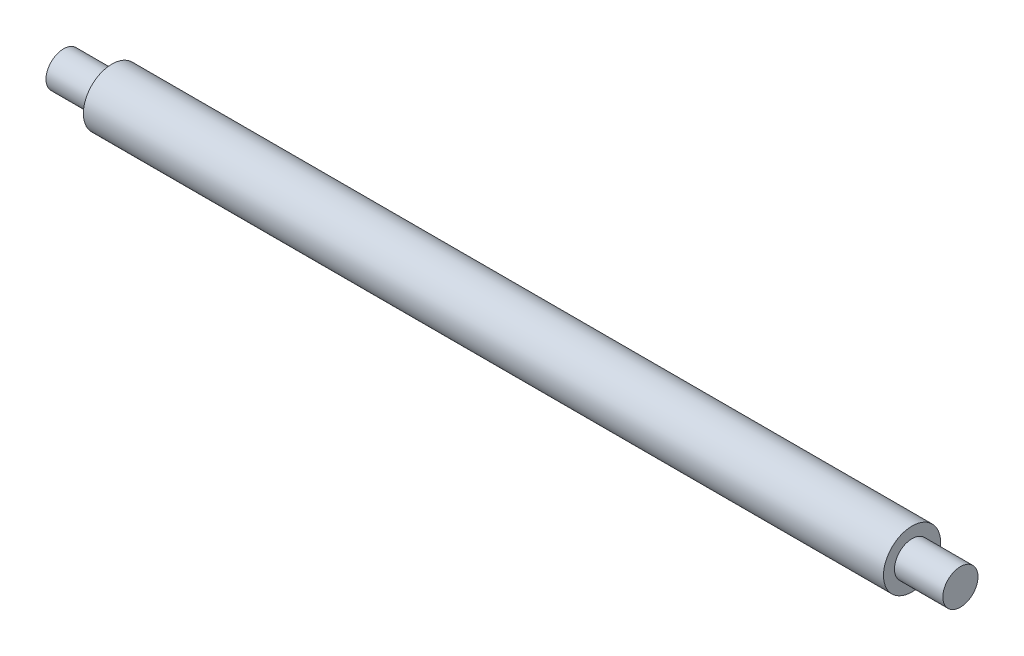
ISO-10303-21;
HEADER;
FILE_DESCRIPTION(('STEP AP214'),'2;1');
FILE_NAME('part.step','',(''),(''),'','','');
FILE_SCHEMA(('AUTOMOTIVE_DESIGN { 1 0 10303 214 1 1 1 1 }'));
ENDSEC;
DATA;
#1=APPLICATION_CONTEXT('core data for automotive mechanical design processes');
#2=APPLICATION_PROTOCOL_DEFINITION('international standard','automotive_design',2000,#1);
#3=PRODUCT_CONTEXT('',#1,'mechanical');
#4=PRODUCT('Part','Part','',(#3));
#5=PRODUCT_RELATED_PRODUCT_CATEGORY('part','',(#4));
#6=PRODUCT_DEFINITION_FORMATION('','',#4);
#7=PRODUCT_DEFINITION_CONTEXT('part definition',#1,'design');
#8=PRODUCT_DEFINITION('design','',#6,#7);
#9=PRODUCT_DEFINITION_SHAPE('','',#8);
#10=(LENGTH_UNIT() NAMED_UNIT(*) SI_UNIT(.MILLI.,.METRE.));
#11=(NAMED_UNIT(*) PLANE_ANGLE_UNIT() SI_UNIT($,.RADIAN.));
#12=(NAMED_UNIT(*) SI_UNIT($,.STERADIAN.) SOLID_ANGLE_UNIT());
#13=UNCERTAINTY_MEASURE_WITH_UNIT(LENGTH_MEASURE(1.E-05),#10,'distance_accuracy_value','');
#14=(GEOMETRIC_REPRESENTATION_CONTEXT(3) GLOBAL_UNCERTAINTY_ASSIGNED_CONTEXT((#13)) GLOBAL_UNIT_ASSIGNED_CONTEXT((#10,
#11,#12)) REPRESENTATION_CONTEXT('',''));
#15=CARTESIAN_POINT('',(0.,0.,0.));
#16=DIRECTION('',(0.,0.,1.));
#17=DIRECTION('',(1.,0.,0.));
#18=AXIS2_PLACEMENT_3D('',#15,#16,#17);
#19=CARTESIAN_POINT('',(0.,4.,0.));
#20=DIRECTION('',(1.,0.,0.));
#21=DIRECTION('',(0.,1.,0.));
#22=AXIS2_PLACEMENT_3D('',#19,#20,#21);
#23=PLANE('',#22);
#24=CARTESIAN_POINT('',(0.,0.,0.));
#25=DIRECTION('',(-1.,0.,0.));
#26=DIRECTION('',(0.,-1.,0.));
#27=AXIS2_PLACEMENT_3D('',#24,#25,#26);
#28=CIRCLE('',#27,4.);
#29=CARTESIAN_POINT('',(0.,-4.,0.));
#30=VERTEX_POINT('',#29);
#31=EDGE_CURVE('E53',#30,#30,#28,.T.);
#32=ORIENTED_EDGE('',*,*,#31,.T.);
#33=EDGE_LOOP('',(#32));
#34=FACE_BOUND('',#33,.T.);
#35=ADVANCED_FACE('F31',(#34),#23,.F.);
#36=CARTESIAN_POINT('',(204.,0.,0.));
#37=DIRECTION('',(-1.,0.,0.));
#38=DIRECTION('',(0.,-1.,0.));
#39=AXIS2_PLACEMENT_3D('',#36,#37,#38);
#40=PLANE('',#39);
#41=CARTESIAN_POINT('',(204.,0.,0.));
#42=DIRECTION('',(-1.,0.,0.));
#43=DIRECTION('',(0.,-1.,0.));
#44=AXIS2_PLACEMENT_3D('',#41,#42,#43);
#45=CIRCLE('',#44,4.00000000000001);
#46=CARTESIAN_POINT('',(204.,-3.99999999999999,0.));
#47=VERTEX_POINT('',#46);
#48=EDGE_CURVE('E10',#47,#47,#45,.T.);
#49=ORIENTED_EDGE('',*,*,#48,.F.);
#50=EDGE_LOOP('',(#49));
#51=FACE_BOUND('',#50,.T.);
#52=ADVANCED_FACE('F83',(#51),#40,.F.);
#53=CARTESIAN_POINT('',(0.,0.,0.));
#54=DIRECTION('',(-1.,0.,0.));
#55=DIRECTION('',(0.,-1.,0.));
#56=AXIS2_PLACEMENT_3D('',#53,#54,#55);
#57=CYLINDRICAL_SURFACE('',#56,4.00000000000001);
#58=CARTESIAN_POINT('',(193.,0.,0.));
#59=DIRECTION('',(-1.,0.,0.));
#60=DIRECTION('',(0.,-1.,0.));
#61=AXIS2_PLACEMENT_3D('',#58,#59,#60);
#62=CIRCLE('',#61,4.00000000000001);
#63=CARTESIAN_POINT('',(193.,-3.99999999999999,0.));
#64=VERTEX_POINT('',#63);
#65=EDGE_CURVE('E37',#64,#64,#62,.T.);
#66=ORIENTED_EDGE('',*,*,#65,.F.);
#67=EDGE_LOOP('',(#66));
#68=FACE_BOUND('',#67,.T.);
#69=ORIENTED_EDGE('',*,*,#48,.T.);
#70=EDGE_LOOP('',(#69));
#71=FACE_BOUND('',#70,.T.);
#72=ADVANCED_FACE('F78',(#68,#71),#57,.T.);
#73=CARTESIAN_POINT('',(193.,4.00000000000003,0.));
#74=DIRECTION('',(-1.,0.,0.));
#75=DIRECTION('',(0.,-1.,0.));
#76=AXIS2_PLACEMENT_3D('',#73,#74,#75);
#77=PLANE('',#76);
#78=CARTESIAN_POINT('',(193.,0.,0.));
#79=DIRECTION('',(-1.,0.,0.));
#80=DIRECTION('',(0.,-1.,0.));
#81=AXIS2_PLACEMENT_3D('',#78,#79,#80);
#82=CIRCLE('',#81,6.5);
#83=CARTESIAN_POINT('',(193.,-6.49999999999998,0.));
#84=VERTEX_POINT('',#83);
#85=EDGE_CURVE('E41',#84,#84,#82,.T.);
#86=ORIENTED_EDGE('',*,*,#85,.F.);
#87=EDGE_LOOP('',(#86));
#88=FACE_BOUND('',#87,.T.);
#89=ORIENTED_EDGE('',*,*,#65,.T.);
#90=EDGE_LOOP('',(#89));
#91=FACE_BOUND('',#90,.T.);
#92=ADVANCED_FACE('F73',(#88,#91),#77,.F.);
#93=CARTESIAN_POINT('',(0.,0.,0.));
#94=DIRECTION('',(-1.,0.,0.));
#95=DIRECTION('',(0.,-1.,0.));
#96=AXIS2_PLACEMENT_3D('',#93,#94,#95);
#97=CYLINDRICAL_SURFACE('',#96,6.5);
#98=CARTESIAN_POINT('',(11.,0.,0.));
#99=DIRECTION('',(-1.,0.,0.));
#100=DIRECTION('',(0.,-1.,0.));
#101=AXIS2_PLACEMENT_3D('',#98,#99,#100);
#102=CIRCLE('',#101,6.5);
#103=CARTESIAN_POINT('',(11.,-6.5,0.));
#104=VERTEX_POINT('',#103);
#105=EDGE_CURVE('E45',#104,#104,#102,.T.);
#106=ORIENTED_EDGE('',*,*,#105,.F.);
#107=EDGE_LOOP('',(#106));
#108=FACE_BOUND('',#107,.T.);
#109=ORIENTED_EDGE('',*,*,#85,.T.);
#110=EDGE_LOOP('',(#109));
#111=FACE_BOUND('',#110,.T.);
#112=ADVANCED_FACE('F67',(#108,#111),#97,.T.);
#113=CARTESIAN_POINT('',(11.,6.5,0.));
#114=DIRECTION('',(1.,0.,0.));
#115=DIRECTION('',(0.,1.,0.));
#116=AXIS2_PLACEMENT_3D('',#113,#114,#115);
#117=PLANE('',#116);
#118=CARTESIAN_POINT('',(11.,0.,0.));
#119=DIRECTION('',(-1.,0.,0.));
#120=DIRECTION('',(0.,-1.,0.));
#121=AXIS2_PLACEMENT_3D('',#118,#119,#120);
#122=CIRCLE('',#121,4.);
#123=CARTESIAN_POINT('',(11.,-4.,0.));
#124=VERTEX_POINT('',#123);
#125=EDGE_CURVE('E50',#124,#124,#122,.T.);
#126=ORIENTED_EDGE('',*,*,#125,.F.);
#127=EDGE_LOOP('',(#126));
#128=FACE_BOUND('',#127,.T.);
#129=ORIENTED_EDGE('',*,*,#105,.T.);
#130=EDGE_LOOP('',(#129));
#131=FACE_BOUND('',#130,.T.);
#132=ADVANCED_FACE('F61',(#128,#131),#117,.F.);
#133=CARTESIAN_POINT('',(0.,0.,0.));
#134=DIRECTION('',(-1.,0.,0.));
#135=DIRECTION('',(0.,-1.,0.));
#136=AXIS2_PLACEMENT_3D('',#133,#134,#135);
#137=CYLINDRICAL_SURFACE('',#136,4.);
#138=ORIENTED_EDGE('',*,*,#31,.F.);
#139=EDGE_LOOP('',(#138));
#140=FACE_BOUND('',#139,.T.);
#141=ORIENTED_EDGE('',*,*,#125,.T.);
#142=EDGE_LOOP('',(#141));
#143=FACE_BOUND('',#142,.T.);
#144=ADVANCED_FACE('F58',(#140,#143),#137,.T.);
#145=CLOSED_SHELL('',(#35,#52,#72,#92,#112,#132,#144));
#146=MANIFOLD_SOLID_BREP('B2',#145);
#147=ADVANCED_BREP_SHAPE_REPRESENTATION('',(#18,#146),#14);
#148=SHAPE_DEFINITION_REPRESENTATION(#9,#147);
ENDSEC;
END-ISO-10303-21;
